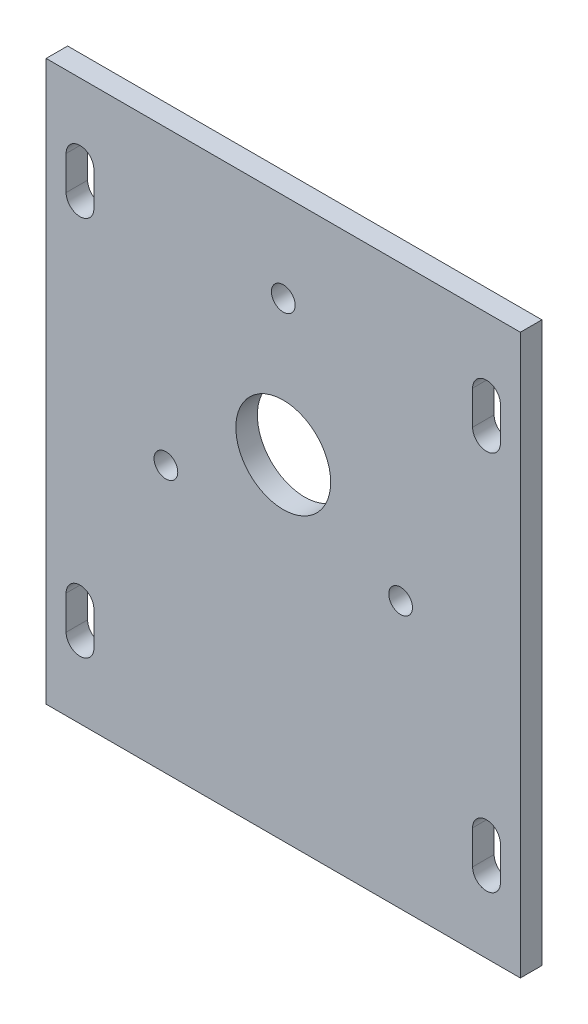
ISO-10303-21;
HEADER;
FILE_DESCRIPTION(('STEP AP214'),'2;1');
FILE_NAME('part.step','',(''),(''),'','','');
FILE_SCHEMA(('AUTOMOTIVE_DESIGN { 1 0 10303 214 1 1 1 1 }'));
ENDSEC;
DATA;
#1=APPLICATION_CONTEXT('core data for automotive mechanical design processes');
#2=APPLICATION_PROTOCOL_DEFINITION('international standard','automotive_design',2000,#1);
#3=PRODUCT_CONTEXT('',#1,'mechanical');
#4=PRODUCT('Part','Part','',(#3));
#5=PRODUCT_RELATED_PRODUCT_CATEGORY('part','',(#4));
#6=PRODUCT_DEFINITION_FORMATION('','',#4);
#7=PRODUCT_DEFINITION_CONTEXT('part definition',#1,'design');
#8=PRODUCT_DEFINITION('design','',#6,#7);
#9=PRODUCT_DEFINITION_SHAPE('','',#8);
#10=(LENGTH_UNIT() NAMED_UNIT(*) SI_UNIT(.MILLI.,.METRE.));
#11=(NAMED_UNIT(*) PLANE_ANGLE_UNIT() SI_UNIT($,.RADIAN.));
#12=(NAMED_UNIT(*) SI_UNIT($,.STERADIAN.) SOLID_ANGLE_UNIT());
#13=UNCERTAINTY_MEASURE_WITH_UNIT(LENGTH_MEASURE(1.E-05),#10,'distance_accuracy_value','');
#14=(GEOMETRIC_REPRESENTATION_CONTEXT(3) GLOBAL_UNCERTAINTY_ASSIGNED_CONTEXT((#13)) GLOBAL_UNIT_ASSIGNED_CONTEXT((#10,
#11,#12)) REPRESENTATION_CONTEXT('',''));
#15=CARTESIAN_POINT('',(0.,0.,0.));
#16=DIRECTION('',(0.,0.,1.));
#17=DIRECTION('',(1.,0.,0.));
#18=AXIS2_PLACEMENT_3D('',#15,#16,#17);
#19=CARTESIAN_POINT('',(0.,0.,3.175));
#20=DIRECTION('',(0.,0.,-1.));
#21=DIRECTION('',(-1.,0.,0.));
#22=AXIS2_PLACEMENT_3D('',#19,#20,#21);
#23=PLANE('',#22);
#24=CARTESIAN_POINT('',(-30.,-25.6,3.175));
#25=DIRECTION('',(0.,0.,1.));
#26=DIRECTION('',(-1.,0.,0.));
#27=AXIS2_PLACEMENT_3D('',#24,#25,#26);
#28=CIRCLE('',#27,2.05000000000001);
#29=CARTESIAN_POINT('',(-27.95,-25.6,3.175));
#30=VERTEX_POINT('',#29);
#31=CARTESIAN_POINT('',(-32.05,-25.6,3.175));
#32=VERTEX_POINT('',#31);
#33=EDGE_CURVE('E269',#30,#32,#28,.T.);
#34=ORIENTED_EDGE('',*,*,#33,.F.);
#35=DIRECTION('',(0.,1.,0.));
#36=VECTOR('',#35,1.);
#37=CARTESIAN_POINT('',(-27.95,-25.6,3.175));
#38=LINE('',#37,#36);
#39=CARTESIAN_POINT('',(-27.95,-30.6,3.175));
#40=VERTEX_POINT('',#39);
#41=EDGE_CURVE('E277',#40,#30,#38,.T.);
#42=ORIENTED_EDGE('',*,*,#41,.F.);
#43=CARTESIAN_POINT('',(-30.,-30.6,3.175));
#44=DIRECTION('',(0.,0.,1.));
#45=DIRECTION('',(-1.,0.,0.));
#46=AXIS2_PLACEMENT_3D('',#43,#44,#45);
#47=CIRCLE('',#46,2.05000000000001);
#48=CARTESIAN_POINT('',(-32.05,-30.6,3.175));
#49=VERTEX_POINT('',#48);
#50=EDGE_CURVE('E274',#49,#40,#47,.T.);
#51=ORIENTED_EDGE('',*,*,#50,.F.);
#52=DIRECTION('',(0.,-1.,0.));
#53=VECTOR('',#52,1.);
#54=CARTESIAN_POINT('',(-32.05,-25.6,3.175));
#55=LINE('',#54,#53);
#56=EDGE_CURVE('E271',#32,#49,#55,.T.);
#57=ORIENTED_EDGE('',*,*,#56,.F.);
#58=EDGE_LOOP('',(#34,#42,#51,#57));
#59=FACE_BOUND('',#58,.T.);
#60=CARTESIAN_POINT('',(-30.,25.6,3.175));
#61=DIRECTION('',(0.,0.,1.));
#62=DIRECTION('',(1.,0.,0.));
#63=AXIS2_PLACEMENT_3D('',#60,#61,#62);
#64=CIRCLE('',#63,2.05000000000001);
#65=CARTESIAN_POINT('',(-32.05,25.6,3.175));
#66=VERTEX_POINT('',#65);
#67=CARTESIAN_POINT('',(-27.95,25.6,3.175));
#68=VERTEX_POINT('',#67);
#69=EDGE_CURVE('E331',#66,#68,#64,.T.);
#70=ORIENTED_EDGE('',*,*,#69,.F.);
#71=DIRECTION('',(0.,-1.,0.));
#72=VECTOR('',#71,1.);
#73=CARTESIAN_POINT('',(-32.05,25.6,3.175));
#74=LINE('',#73,#72);
#75=CARTESIAN_POINT('',(-32.05,30.6,3.175));
#76=VERTEX_POINT('',#75);
#77=EDGE_CURVE('E339',#76,#66,#74,.T.);
#78=ORIENTED_EDGE('',*,*,#77,.F.);
#79=CARTESIAN_POINT('',(-30.,30.6,3.175));
#80=DIRECTION('',(0.,0.,1.));
#81=DIRECTION('',(1.,0.,0.));
#82=AXIS2_PLACEMENT_3D('',#79,#80,#81);
#83=CIRCLE('',#82,2.05000000000001);
#84=CARTESIAN_POINT('',(-27.95,30.6,3.175));
#85=VERTEX_POINT('',#84);
#86=EDGE_CURVE('E336',#85,#76,#83,.T.);
#87=ORIENTED_EDGE('',*,*,#86,.F.);
#88=DIRECTION('',(0.,1.,0.));
#89=VECTOR('',#88,1.);
#90=CARTESIAN_POINT('',(-27.95,25.6,3.175));
#91=LINE('',#90,#89);
#92=EDGE_CURVE('E333',#68,#85,#91,.T.);
#93=ORIENTED_EDGE('',*,*,#92,.F.);
#94=EDGE_LOOP('',(#70,#78,#87,#93));
#95=FACE_BOUND('',#94,.T.);
#96=DIRECTION('',(0.,1.,0.));
#97=VECTOR('',#96,1.);
#98=CARTESIAN_POINT('',(35.,-38.1,3.175));
#99=LINE('',#98,#97);
#100=CARTESIAN_POINT('',(35.,-41.275,3.175));
#101=VERTEX_POINT('',#100);
#102=CARTESIAN_POINT('',(35.,41.275,3.175));
#103=VERTEX_POINT('',#102);
#104=EDGE_CURVE('E52',#101,#103,#99,.T.);
#105=ORIENTED_EDGE('',*,*,#104,.T.);
#106=DIRECTION('',(-1.,0.,0.));
#107=VECTOR('',#106,1.);
#108=CARTESIAN_POINT('',(-35.,41.275,3.175));
#109=LINE('',#108,#107);
#110=CARTESIAN_POINT('',(-35.,41.275,3.175));
#111=VERTEX_POINT('',#110);
#112=EDGE_CURVE('E210',#103,#111,#109,.T.);
#113=ORIENTED_EDGE('',*,*,#112,.T.);
#114=DIRECTION('',(0.,-1.,0.));
#115=VECTOR('',#114,1.);
#116=CARTESIAN_POINT('',(-35.,-38.1,3.175));
#117=LINE('',#116,#115);
#118=CARTESIAN_POINT('',(-35.,-41.275,3.175));
#119=VERTEX_POINT('',#118);
#120=EDGE_CURVE('E11',#111,#119,#117,.T.);
#121=ORIENTED_EDGE('',*,*,#120,.T.);
#122=DIRECTION('',(1.,0.,0.));
#123=VECTOR('',#122,1.);
#124=CARTESIAN_POINT('',(-35.,-41.275,3.175));
#125=LINE('',#124,#123);
#126=EDGE_CURVE('E201',#119,#101,#125,.T.);
#127=ORIENTED_EDGE('',*,*,#126,.T.);
#128=EDGE_LOOP('',(#105,#113,#121,#127));
#129=FACE_BOUND('',#128,.T.);
#130=CARTESIAN_POINT('',(30.,25.6,3.175));
#131=DIRECTION('',(0.,0.,1.));
#132=DIRECTION('',(-1.,0.,0.));
#133=AXIS2_PLACEMENT_3D('',#130,#131,#132);
#134=CIRCLE('',#133,2.05000000000001);
#135=CARTESIAN_POINT('',(27.95,25.6,3.175));
#136=VERTEX_POINT('',#135);
#137=CARTESIAN_POINT('',(32.05,25.6,3.175));
#138=VERTEX_POINT('',#137);
#139=EDGE_CURVE('E300',#136,#138,#134,.T.);
#140=ORIENTED_EDGE('',*,*,#139,.F.);
#141=DIRECTION('',(0.,-1.,0.));
#142=VECTOR('',#141,1.);
#143=CARTESIAN_POINT('',(27.95,25.6,3.175));
#144=LINE('',#143,#142);
#145=CARTESIAN_POINT('',(27.95,30.6,3.175));
#146=VERTEX_POINT('',#145);
#147=EDGE_CURVE('E308',#146,#136,#144,.T.);
#148=ORIENTED_EDGE('',*,*,#147,.F.);
#149=CARTESIAN_POINT('',(30.,30.6,3.175));
#150=DIRECTION('',(0.,0.,1.));
#151=DIRECTION('',(-1.,0.,0.));
#152=AXIS2_PLACEMENT_3D('',#149,#150,#151);
#153=CIRCLE('',#152,2.05000000000001);
#154=CARTESIAN_POINT('',(32.05,30.6,3.175));
#155=VERTEX_POINT('',#154);
#156=EDGE_CURVE('E305',#155,#146,#153,.T.);
#157=ORIENTED_EDGE('',*,*,#156,.F.);
#158=DIRECTION('',(0.,1.,0.));
#159=VECTOR('',#158,1.);
#160=CARTESIAN_POINT('',(32.05,25.6,3.175));
#161=LINE('',#160,#159);
#162=EDGE_CURVE('E302',#138,#155,#161,.T.);
#163=ORIENTED_EDGE('',*,*,#162,.F.);
#164=EDGE_LOOP('',(#140,#148,#157,#163));
#165=FACE_BOUND('',#164,.T.);
#166=CARTESIAN_POINT('',(30.,-25.6,3.175));
#167=DIRECTION('',(0.,0.,1.));
#168=DIRECTION('',(1.,0.,0.));
#169=AXIS2_PLACEMENT_3D('',#166,#167,#168);
#170=CIRCLE('',#169,2.05000000000001);
#171=CARTESIAN_POINT('',(32.05,-25.6,3.175));
#172=VERTEX_POINT('',#171);
#173=CARTESIAN_POINT('',(27.95,-25.6,3.175));
#174=VERTEX_POINT('',#173);
#175=EDGE_CURVE('E243',#172,#174,#170,.T.);
#176=ORIENTED_EDGE('',*,*,#175,.F.);
#177=DIRECTION('',(0.,1.,0.));
#178=VECTOR('',#177,1.);
#179=CARTESIAN_POINT('',(32.05,-25.6,3.175));
#180=LINE('',#179,#178);
#181=CARTESIAN_POINT('',(32.05,-30.6,3.175));
#182=VERTEX_POINT('',#181);
#183=EDGE_CURVE('E250',#182,#172,#180,.T.);
#184=ORIENTED_EDGE('',*,*,#183,.F.);
#185=CARTESIAN_POINT('',(30.,-30.6,3.175));
#186=DIRECTION('',(0.,0.,1.));
#187=DIRECTION('',(1.,0.,0.));
#188=AXIS2_PLACEMENT_3D('',#185,#186,#187);
#189=CIRCLE('',#188,2.05000000000001);
#190=CARTESIAN_POINT('',(27.95,-30.6,3.175));
#191=VERTEX_POINT('',#190);
#192=EDGE_CURVE('E248',#191,#182,#189,.T.);
#193=ORIENTED_EDGE('',*,*,#192,.F.);
#194=DIRECTION('',(0.,-1.,0.));
#195=VECTOR('',#194,1.);
#196=CARTESIAN_POINT('',(27.95,-25.6,3.175));
#197=LINE('',#196,#195);
#198=EDGE_CURVE('E245',#174,#191,#197,.T.);
#199=ORIENTED_EDGE('',*,*,#198,.F.);
#200=EDGE_LOOP('',(#176,#184,#193,#199));
#201=FACE_BOUND('',#200,.T.);
#202=CARTESIAN_POINT('',(0.,28.1,3.175));
#203=DIRECTION('',(0.,0.,1.));
#204=DIRECTION('',(1.,0.,0.));
#205=AXIS2_PLACEMENT_3D('',#202,#203,#204);
#206=CIRCLE('',#205,1.75);
#207=CARTESIAN_POINT('',(1.75,28.1,3.175));
#208=VERTEX_POINT('',#207);
#209=EDGE_CURVE('E238',#208,#208,#206,.T.);
#210=ORIENTED_EDGE('',*,*,#209,.F.);
#211=EDGE_LOOP('',(#210));
#212=FACE_BOUND('',#211,.T.);
#213=CARTESIAN_POINT('',(0.,8.09999999999998,3.175));
#214=DIRECTION('',(0.,0.,1.));
#215=DIRECTION('',(1.,0.,0.));
#216=AXIS2_PLACEMENT_3D('',#213,#214,#215);
#217=CIRCLE('',#216,7.);
#218=CARTESIAN_POINT('',(7.,8.09999999999998,3.175));
#219=VERTEX_POINT('',#218);
#220=EDGE_CURVE('E232',#219,#219,#217,.T.);
#221=ORIENTED_EDGE('',*,*,#220,.F.);
#222=EDGE_LOOP('',(#221));
#223=FACE_BOUND('',#222,.T.);
#224=CARTESIAN_POINT('',(17.3205080756888,-1.90000000000003,3.175));
#225=DIRECTION('',(0.,0.,1.));
#226=DIRECTION('',(1.,0.,0.));
#227=AXIS2_PLACEMENT_3D('',#224,#225,#226);
#228=CIRCLE('',#227,1.74999999999871);
#229=CARTESIAN_POINT('',(19.0705080756875,-1.90000000000003,3.175));
#230=VERTEX_POINT('',#229);
#231=EDGE_CURVE('E226',#230,#230,#228,.T.);
#232=ORIENTED_EDGE('',*,*,#231,.F.);
#233=EDGE_LOOP('',(#232));
#234=FACE_BOUND('',#233,.T.);
#235=CARTESIAN_POINT('',(-17.3205080756888,-1.90000000000004,3.175));
#236=DIRECTION('',(0.,0.,1.));
#237=DIRECTION('',(1.,0.,0.));
#238=AXIS2_PLACEMENT_3D('',#235,#236,#237);
#239=CIRCLE('',#238,1.74999999999829);
#240=CARTESIAN_POINT('',(-15.5705080756905,-1.90000000000004,3.175));
#241=VERTEX_POINT('',#240);
#242=EDGE_CURVE('E220',#241,#241,#239,.T.);
#243=ORIENTED_EDGE('',*,*,#242,.F.);
#244=EDGE_LOOP('',(#243));
#245=FACE_BOUND('',#244,.T.);
#246=ADVANCED_FACE('F43',(#59,#95,#129,#165,#201,#212,#223,#234,#245),#23,.F.);
#247=CARTESIAN_POINT('',(0.,0.,0.));
#248=DIRECTION('',(0.,0.,-1.));
#249=DIRECTION('',(-1.,0.,0.));
#250=AXIS2_PLACEMENT_3D('',#247,#248,#249);
#251=PLANE('',#250);
#252=CARTESIAN_POINT('',(17.3205080756888,-1.90000000000003,0.));
#253=DIRECTION('',(0.,0.,1.));
#254=DIRECTION('',(1.,0.,0.));
#255=AXIS2_PLACEMENT_3D('',#252,#253,#254);
#256=CIRCLE('',#255,1.74999999999871);
#257=CARTESIAN_POINT('',(19.0705080756875,-1.90000000000003,0.));
#258=VERTEX_POINT('',#257);
#259=EDGE_CURVE('E223',#258,#258,#256,.T.);
#260=ORIENTED_EDGE('',*,*,#259,.T.);
#261=EDGE_LOOP('',(#260));
#262=FACE_BOUND('',#261,.T.);
#263=CARTESIAN_POINT('',(0.,28.1,0.));
#264=DIRECTION('',(0.,0.,1.));
#265=DIRECTION('',(1.,0.,0.));
#266=AXIS2_PLACEMENT_3D('',#263,#264,#265);
#267=CIRCLE('',#266,1.75);
#268=CARTESIAN_POINT('',(1.75,28.1,0.));
#269=VERTEX_POINT('',#268);
#270=EDGE_CURVE('E235',#269,#269,#267,.T.);
#271=ORIENTED_EDGE('',*,*,#270,.T.);
#272=EDGE_LOOP('',(#271));
#273=FACE_BOUND('',#272,.T.);
#274=DIRECTION('',(0.,1.,0.));
#275=VECTOR('',#274,1.);
#276=CARTESIAN_POINT('',(35.,-38.1,0.));
#277=LINE('',#276,#275);
#278=CARTESIAN_POINT('',(35.,-41.275,0.));
#279=VERTEX_POINT('',#278);
#280=CARTESIAN_POINT('',(35.,41.275,0.));
#281=VERTEX_POINT('',#280);
#282=EDGE_CURVE('E193',#279,#281,#277,.T.);
#283=ORIENTED_EDGE('',*,*,#282,.F.);
#284=DIRECTION('',(1.,0.,0.));
#285=VECTOR('',#284,1.);
#286=CARTESIAN_POINT('',(-35.,-41.275,0.));
#287=LINE('',#286,#285);
#288=CARTESIAN_POINT('',(-35.,-41.275,0.));
#289=VERTEX_POINT('',#288);
#290=EDGE_CURVE('E195',#289,#279,#287,.T.);
#291=ORIENTED_EDGE('',*,*,#290,.F.);
#292=DIRECTION('',(0.,-1.,0.));
#293=VECTOR('',#292,1.);
#294=CARTESIAN_POINT('',(-35.,-38.1,0.));
#295=LINE('',#294,#293);
#296=CARTESIAN_POINT('',(-35.,41.275,0.));
#297=VERTEX_POINT('',#296);
#298=EDGE_CURVE('E47',#297,#289,#295,.T.);
#299=ORIENTED_EDGE('',*,*,#298,.F.);
#300=DIRECTION('',(-1.,0.,0.));
#301=VECTOR('',#300,1.);
#302=CARTESIAN_POINT('',(-35.,41.275,0.));
#303=LINE('',#302,#301);
#304=EDGE_CURVE('E214',#281,#297,#303,.T.);
#305=ORIENTED_EDGE('',*,*,#304,.F.);
#306=EDGE_LOOP('',(#283,#291,#299,#305));
#307=FACE_BOUND('',#306,.T.);
#308=DIRECTION('',(0.,-1.,0.));
#309=VECTOR('',#308,1.);
#310=CARTESIAN_POINT('',(-32.05,25.6,0.));
#311=LINE('',#310,#309);
#312=CARTESIAN_POINT('',(-32.05,30.6,0.));
#313=VERTEX_POINT('',#312);
#314=CARTESIAN_POINT('',(-32.05,25.6,0.));
#315=VERTEX_POINT('',#314);
#316=EDGE_CURVE('E334',#313,#315,#311,.T.);
#317=ORIENTED_EDGE('',*,*,#316,.T.);
#318=CARTESIAN_POINT('',(-30.,25.6,0.));
#319=DIRECTION('',(0.,0.,1.));
#320=DIRECTION('',(1.,0.,0.));
#321=AXIS2_PLACEMENT_3D('',#318,#319,#320);
#322=CIRCLE('',#321,2.05000000000001);
#323=CARTESIAN_POINT('',(-27.95,25.6,0.));
#324=VERTEX_POINT('',#323);
#325=EDGE_CURVE('E330',#315,#324,#322,.T.);
#326=ORIENTED_EDGE('',*,*,#325,.T.);
#327=DIRECTION('',(0.,1.,0.));
#328=VECTOR('',#327,1.);
#329=CARTESIAN_POINT('',(-27.95,25.6,0.));
#330=LINE('',#329,#328);
#331=CARTESIAN_POINT('',(-27.95,30.6,0.));
#332=VERTEX_POINT('',#331);
#333=EDGE_CURVE('E344',#324,#332,#330,.T.);
#334=ORIENTED_EDGE('',*,*,#333,.T.);
#335=CARTESIAN_POINT('',(-30.,30.6,0.));
#336=DIRECTION('',(0.,0.,1.));
#337=DIRECTION('',(1.,0.,0.));
#338=AXIS2_PLACEMENT_3D('',#335,#336,#337);
#339=CIRCLE('',#338,2.05000000000001);
#340=EDGE_CURVE('E347',#332,#313,#339,.T.);
#341=ORIENTED_EDGE('',*,*,#340,.T.);
#342=EDGE_LOOP('',(#317,#326,#334,#341));
#343=FACE_BOUND('',#342,.T.);
#344=DIRECTION('',(0.,-1.,0.));
#345=VECTOR('',#344,1.);
#346=CARTESIAN_POINT('',(27.95,25.6,0.));
#347=LINE('',#346,#345);
#348=CARTESIAN_POINT('',(27.95,30.6,0.));
#349=VERTEX_POINT('',#348);
#350=CARTESIAN_POINT('',(27.95,25.6,0.));
#351=VERTEX_POINT('',#350);
#352=EDGE_CURVE('E303',#349,#351,#347,.T.);
#353=ORIENTED_EDGE('',*,*,#352,.T.);
#354=CARTESIAN_POINT('',(30.,25.6,0.));
#355=DIRECTION('',(0.,0.,1.));
#356=DIRECTION('',(-1.,0.,0.));
#357=AXIS2_PLACEMENT_3D('',#354,#355,#356);
#358=CIRCLE('',#357,2.05000000000001);
#359=CARTESIAN_POINT('',(32.05,25.6,0.));
#360=VERTEX_POINT('',#359);
#361=EDGE_CURVE('E299',#351,#360,#358,.T.);
#362=ORIENTED_EDGE('',*,*,#361,.T.);
#363=DIRECTION('',(0.,1.,0.));
#364=VECTOR('',#363,1.);
#365=CARTESIAN_POINT('',(32.05,25.6,0.));
#366=LINE('',#365,#364);
#367=CARTESIAN_POINT('',(32.05,30.6,0.));
#368=VERTEX_POINT('',#367);
#369=EDGE_CURVE('E313',#360,#368,#366,.T.);
#370=ORIENTED_EDGE('',*,*,#369,.T.);
#371=CARTESIAN_POINT('',(30.,30.6,0.));
#372=DIRECTION('',(0.,0.,1.));
#373=DIRECTION('',(-1.,0.,0.));
#374=AXIS2_PLACEMENT_3D('',#371,#372,#373);
#375=CIRCLE('',#374,2.05000000000001);
#376=EDGE_CURVE('E316',#368,#349,#375,.T.);
#377=ORIENTED_EDGE('',*,*,#376,.T.);
#378=EDGE_LOOP('',(#353,#362,#370,#377));
#379=FACE_BOUND('',#378,.T.);
#380=DIRECTION('',(0.,1.,0.));
#381=VECTOR('',#380,1.);
#382=CARTESIAN_POINT('',(-27.95,-25.6,0.));
#383=LINE('',#382,#381);
#384=CARTESIAN_POINT('',(-27.95,-30.6,0.));
#385=VERTEX_POINT('',#384);
#386=CARTESIAN_POINT('',(-27.95,-25.6,0.));
#387=VERTEX_POINT('',#386);
#388=EDGE_CURVE('E272',#385,#387,#383,.T.);
#389=ORIENTED_EDGE('',*,*,#388,.T.);
#390=CARTESIAN_POINT('',(-30.,-25.6,0.));
#391=DIRECTION('',(0.,0.,1.));
#392=DIRECTION('',(-1.,0.,0.));
#393=AXIS2_PLACEMENT_3D('',#390,#391,#392);
#394=CIRCLE('',#393,2.05000000000001);
#395=CARTESIAN_POINT('',(-32.05,-25.6,0.));
#396=VERTEX_POINT('',#395);
#397=EDGE_CURVE('E268',#387,#396,#394,.T.);
#398=ORIENTED_EDGE('',*,*,#397,.T.);
#399=DIRECTION('',(0.,-1.,0.));
#400=VECTOR('',#399,1.);
#401=CARTESIAN_POINT('',(-32.05,-25.6,0.));
#402=LINE('',#401,#400);
#403=CARTESIAN_POINT('',(-32.05,-30.6,0.));
#404=VERTEX_POINT('',#403);
#405=EDGE_CURVE('E282',#396,#404,#402,.T.);
#406=ORIENTED_EDGE('',*,*,#405,.T.);
#407=CARTESIAN_POINT('',(-30.,-30.6,0.));
#408=DIRECTION('',(0.,0.,1.));
#409=DIRECTION('',(-1.,0.,0.));
#410=AXIS2_PLACEMENT_3D('',#407,#408,#409);
#411=CIRCLE('',#410,2.05000000000001);
#412=EDGE_CURVE('E285',#404,#385,#411,.T.);
#413=ORIENTED_EDGE('',*,*,#412,.T.);
#414=EDGE_LOOP('',(#389,#398,#406,#413));
#415=FACE_BOUND('',#414,.T.);
#416=DIRECTION('',(0.,1.,0.));
#417=VECTOR('',#416,1.);
#418=CARTESIAN_POINT('',(32.05,-25.6,0.));
#419=LINE('',#418,#417);
#420=CARTESIAN_POINT('',(32.05,-30.6,0.));
#421=VERTEX_POINT('',#420);
#422=CARTESIAN_POINT('',(32.05,-25.6,0.));
#423=VERTEX_POINT('',#422);
#424=EDGE_CURVE('E246',#421,#423,#419,.T.);
#425=ORIENTED_EDGE('',*,*,#424,.T.);
#426=CARTESIAN_POINT('',(30.,-25.6,0.));
#427=DIRECTION('',(0.,0.,1.));
#428=DIRECTION('',(1.,0.,0.));
#429=AXIS2_PLACEMENT_3D('',#426,#427,#428);
#430=CIRCLE('',#429,2.05000000000001);
#431=CARTESIAN_POINT('',(27.95,-25.6,0.));
#432=VERTEX_POINT('',#431);
#433=EDGE_CURVE('E68',#423,#432,#430,.T.);
#434=ORIENTED_EDGE('',*,*,#433,.T.);
#435=DIRECTION('',(0.,-1.,0.));
#436=VECTOR('',#435,1.);
#437=CARTESIAN_POINT('',(27.95,-25.6,0.));
#438=LINE('',#437,#436);
#439=CARTESIAN_POINT('',(27.95,-30.6,0.));
#440=VERTEX_POINT('',#439);
#441=EDGE_CURVE('E254',#432,#440,#438,.T.);
#442=ORIENTED_EDGE('',*,*,#441,.T.);
#443=CARTESIAN_POINT('',(30.,-30.6,0.));
#444=DIRECTION('',(0.,0.,1.));
#445=DIRECTION('',(1.,0.,0.));
#446=AXIS2_PLACEMENT_3D('',#443,#444,#445);
#447=CIRCLE('',#446,2.05000000000001);
#448=EDGE_CURVE('E257',#440,#421,#447,.T.);
#449=ORIENTED_EDGE('',*,*,#448,.T.);
#450=EDGE_LOOP('',(#425,#434,#442,#449));
#451=FACE_BOUND('',#450,.T.);
#452=CARTESIAN_POINT('',(0.,8.09999999999998,0.));
#453=DIRECTION('',(0.,0.,1.));
#454=DIRECTION('',(1.,0.,0.));
#455=AXIS2_PLACEMENT_3D('',#452,#453,#454);
#456=CIRCLE('',#455,7.);
#457=CARTESIAN_POINT('',(7.,8.09999999999998,0.));
#458=VERTEX_POINT('',#457);
#459=EDGE_CURVE('E229',#458,#458,#456,.T.);
#460=ORIENTED_EDGE('',*,*,#459,.T.);
#461=EDGE_LOOP('',(#460));
#462=FACE_BOUND('',#461,.T.);
#463=CARTESIAN_POINT('',(-17.3205080756888,-1.90000000000004,0.));
#464=DIRECTION('',(0.,0.,1.));
#465=DIRECTION('',(1.,0.,0.));
#466=AXIS2_PLACEMENT_3D('',#463,#464,#465);
#467=CIRCLE('',#466,1.74999999999829);
#468=CARTESIAN_POINT('',(-15.5705080756905,-1.90000000000004,0.));
#469=VERTEX_POINT('',#468);
#470=EDGE_CURVE('E217',#469,#469,#467,.T.);
#471=ORIENTED_EDGE('',*,*,#470,.T.);
#472=EDGE_LOOP('',(#471));
#473=FACE_BOUND('',#472,.T.);
#474=ADVANCED_FACE('F196',(#262,#273,#307,#343,#379,#415,#451,#462,#473),#251,.T.);
#475=CARTESIAN_POINT('',(35.,-38.1,3.175));
#476=DIRECTION('',(-1.,0.,0.));
#477=DIRECTION('',(0.,0.,1.));
#478=AXIS2_PLACEMENT_3D('',#475,#476,#477);
#479=PLANE('',#478);
#480=ORIENTED_EDGE('',*,*,#282,.T.);
#481=DIRECTION('',(0.,0.,1.));
#482=VECTOR('',#481,1.);
#483=CARTESIAN_POINT('',(35.,41.275,-70.071967469167));
#484=LINE('',#483,#482);
#485=EDGE_CURVE('E213',#281,#103,#484,.T.);
#486=ORIENTED_EDGE('',*,*,#485,.T.);
#487=ORIENTED_EDGE('',*,*,#104,.F.);
#488=DIRECTION('',(0.,0.,1.));
#489=VECTOR('',#488,1.);
#490=CARTESIAN_POINT('',(35.,-41.275,-70.071967469167));
#491=LINE('',#490,#489);
#492=EDGE_CURVE('E202',#279,#101,#491,.T.);
#493=ORIENTED_EDGE('',*,*,#492,.F.);
#494=EDGE_LOOP('',(#480,#486,#487,#493));
#495=FACE_BOUND('',#494,.T.);
#496=ADVANCED_FACE('F45',(#495),#479,.F.);
#497=CARTESIAN_POINT('',(-35.,-38.1,3.175));
#498=DIRECTION('',(1.,0.,0.));
#499=DIRECTION('',(0.,0.,-1.));
#500=AXIS2_PLACEMENT_3D('',#497,#498,#499);
#501=PLANE('',#500);
#502=ORIENTED_EDGE('',*,*,#298,.T.);
#503=DIRECTION('',(0.,0.,1.));
#504=VECTOR('',#503,1.);
#505=CARTESIAN_POINT('',(-35.,-41.275,-70.071967469167));
#506=LINE('',#505,#504);
#507=EDGE_CURVE('E186',#289,#119,#506,.T.);
#508=ORIENTED_EDGE('',*,*,#507,.T.);
#509=ORIENTED_EDGE('',*,*,#120,.F.);
#510=DIRECTION('',(0.,0.,1.));
#511=VECTOR('',#510,1.);
#512=CARTESIAN_POINT('',(-35.,41.275,-70.071967469167));
#513=LINE('',#512,#511);
#514=EDGE_CURVE('E189',#297,#111,#513,.T.);
#515=ORIENTED_EDGE('',*,*,#514,.F.);
#516=EDGE_LOOP('',(#502,#508,#509,#515));
#517=FACE_BOUND('',#516,.T.);
#518=ADVANCED_FACE('F184',(#517),#501,.F.);
#519=CARTESIAN_POINT('',(-30.,25.6,3.175));
#520=DIRECTION('',(0.,0.,-1.));
#521=DIRECTION('',(-1.,0.,0.));
#522=AXIS2_PLACEMENT_3D('',#519,#520,#521);
#523=CYLINDRICAL_SURFACE('',#522,2.05000000000001);
#524=ORIENTED_EDGE('',*,*,#325,.F.);
#525=DIRECTION('',(0.,0.,-1.));
#526=VECTOR('',#525,1.);
#527=CARTESIAN_POINT('',(-32.05,25.6,3.175));
#528=LINE('',#527,#526);
#529=EDGE_CURVE('E341',#66,#315,#528,.T.);
#530=ORIENTED_EDGE('',*,*,#529,.F.);
#531=ORIENTED_EDGE('',*,*,#69,.T.);
#532=DIRECTION('',(0.,0.,-1.));
#533=VECTOR('',#532,1.);
#534=CARTESIAN_POINT('',(-27.95,25.6,3.175));
#535=LINE('',#534,#533);
#536=EDGE_CURVE('E358',#68,#324,#535,.T.);
#537=ORIENTED_EDGE('',*,*,#536,.T.);
#538=EDGE_LOOP('',(#524,#530,#531,#537));
#539=FACE_BOUND('',#538,.T.);
#540=ADVANCED_FACE('F403',(#539),#523,.F.);
#541=CARTESIAN_POINT('',(-27.95,25.6,3.175));
#542=DIRECTION('',(-1.,0.,0.));
#543=DIRECTION('',(0.,0.,1.));
#544=AXIS2_PLACEMENT_3D('',#541,#542,#543);
#545=PLANE('',#544);
#546=ORIENTED_EDGE('',*,*,#333,.F.);
#547=ORIENTED_EDGE('',*,*,#536,.F.);
#548=ORIENTED_EDGE('',*,*,#92,.T.);
#549=DIRECTION('',(0.,0.,-1.));
#550=VECTOR('',#549,1.);
#551=CARTESIAN_POINT('',(-27.95,30.6,3.175));
#552=LINE('',#551,#550);
#553=EDGE_CURVE('E356',#85,#332,#552,.T.);
#554=ORIENTED_EDGE('',*,*,#553,.T.);
#555=EDGE_LOOP('',(#546,#547,#548,#554));
#556=FACE_BOUND('',#555,.T.);
#557=ADVANCED_FACE('F408',(#556),#545,.T.);
#558=CARTESIAN_POINT('',(-30.,30.6,3.175));
#559=DIRECTION('',(0.,0.,-1.));
#560=DIRECTION('',(-1.,0.,0.));
#561=AXIS2_PLACEMENT_3D('',#558,#559,#560);
#562=CYLINDRICAL_SURFACE('',#561,2.05000000000001);
#563=ORIENTED_EDGE('',*,*,#340,.F.);
#564=ORIENTED_EDGE('',*,*,#553,.F.);
#565=ORIENTED_EDGE('',*,*,#86,.T.);
#566=DIRECTION('',(0.,0.,-1.));
#567=VECTOR('',#566,1.);
#568=CARTESIAN_POINT('',(-32.05,30.6,3.175));
#569=LINE('',#568,#567);
#570=EDGE_CURVE('E354',#76,#313,#569,.T.);
#571=ORIENTED_EDGE('',*,*,#570,.T.);
#572=EDGE_LOOP('',(#563,#564,#565,#571));
#573=FACE_BOUND('',#572,.T.);
#574=ADVANCED_FACE('F413',(#573),#562,.F.);
#575=CARTESIAN_POINT('',(-32.05,25.6,3.175));
#576=DIRECTION('',(1.,0.,0.));
#577=DIRECTION('',(0.,0.,-1.));
#578=AXIS2_PLACEMENT_3D('',#575,#576,#577);
#579=PLANE('',#578);
#580=ORIENTED_EDGE('',*,*,#316,.F.);
#581=ORIENTED_EDGE('',*,*,#570,.F.);
#582=ORIENTED_EDGE('',*,*,#77,.T.);
#583=ORIENTED_EDGE('',*,*,#529,.T.);
#584=EDGE_LOOP('',(#580,#581,#582,#583));
#585=FACE_BOUND('',#584,.T.);
#586=ADVANCED_FACE('F419',(#585),#579,.T.);
#587=CARTESIAN_POINT('',(30.,25.6,3.175));
#588=DIRECTION('',(0.,0.,-1.));
#589=DIRECTION('',(-1.,0.,0.));
#590=AXIS2_PLACEMENT_3D('',#587,#588,#589);
#591=CYLINDRICAL_SURFACE('',#590,2.05000000000001);
#592=ORIENTED_EDGE('',*,*,#361,.F.);
#593=DIRECTION('',(0.,0.,-1.));
#594=VECTOR('',#593,1.);
#595=CARTESIAN_POINT('',(27.95,25.6,3.175));
#596=LINE('',#595,#594);
#597=EDGE_CURVE('E310',#136,#351,#596,.T.);
#598=ORIENTED_EDGE('',*,*,#597,.F.);
#599=ORIENTED_EDGE('',*,*,#139,.T.);
#600=DIRECTION('',(0.,0.,-1.));
#601=VECTOR('',#600,1.);
#602=CARTESIAN_POINT('',(32.05,25.6,3.175));
#603=LINE('',#602,#601);
#604=EDGE_CURVE('E327',#138,#360,#603,.T.);
#605=ORIENTED_EDGE('',*,*,#604,.T.);
#606=EDGE_LOOP('',(#592,#598,#599,#605));
#607=FACE_BOUND('',#606,.T.);
#608=ADVANCED_FACE('F423',(#607),#591,.F.);
#609=CARTESIAN_POINT('',(32.05,25.6,3.175));
#610=DIRECTION('',(-1.,0.,0.));
#611=DIRECTION('',(0.,0.,1.));
#612=AXIS2_PLACEMENT_3D('',#609,#610,#611);
#613=PLANE('',#612);
#614=ORIENTED_EDGE('',*,*,#369,.F.);
#615=ORIENTED_EDGE('',*,*,#604,.F.);
#616=ORIENTED_EDGE('',*,*,#162,.T.);
#617=DIRECTION('',(0.,0.,-1.));
#618=VECTOR('',#617,1.);
#619=CARTESIAN_POINT('',(32.05,30.6,3.175));
#620=LINE('',#619,#618);
#621=EDGE_CURVE('E325',#155,#368,#620,.T.);
#622=ORIENTED_EDGE('',*,*,#621,.T.);
#623=EDGE_LOOP('',(#614,#615,#616,#622));
#624=FACE_BOUND('',#623,.T.);
#625=ADVANCED_FACE('F427',(#624),#613,.T.);
#626=CARTESIAN_POINT('',(30.,30.6,3.175));
#627=DIRECTION('',(0.,0.,-1.));
#628=DIRECTION('',(-1.,0.,0.));
#629=AXIS2_PLACEMENT_3D('',#626,#627,#628);
#630=CYLINDRICAL_SURFACE('',#629,2.05000000000001);
#631=ORIENTED_EDGE('',*,*,#376,.F.);
#632=ORIENTED_EDGE('',*,*,#621,.F.);
#633=ORIENTED_EDGE('',*,*,#156,.T.);
#634=DIRECTION('',(0.,0.,-1.));
#635=VECTOR('',#634,1.);
#636=CARTESIAN_POINT('',(27.95,30.6,3.175));
#637=LINE('',#636,#635);
#638=EDGE_CURVE('E323',#146,#349,#637,.T.);
#639=ORIENTED_EDGE('',*,*,#638,.T.);
#640=EDGE_LOOP('',(#631,#632,#633,#639));
#641=FACE_BOUND('',#640,.T.);
#642=ADVANCED_FACE('F431',(#641),#630,.F.);
#643=CARTESIAN_POINT('',(27.95,25.6,3.175));
#644=DIRECTION('',(1.,0.,0.));
#645=DIRECTION('',(0.,0.,-1.));
#646=AXIS2_PLACEMENT_3D('',#643,#644,#645);
#647=PLANE('',#646);
#648=ORIENTED_EDGE('',*,*,#352,.F.);
#649=ORIENTED_EDGE('',*,*,#638,.F.);
#650=ORIENTED_EDGE('',*,*,#147,.T.);
#651=ORIENTED_EDGE('',*,*,#597,.T.);
#652=EDGE_LOOP('',(#648,#649,#650,#651));
#653=FACE_BOUND('',#652,.T.);
#654=ADVANCED_FACE('F435',(#653),#647,.T.);
#655=CARTESIAN_POINT('',(-30.,-25.6,3.175));
#656=DIRECTION('',(0.,0.,-1.));
#657=DIRECTION('',(-1.,0.,0.));
#658=AXIS2_PLACEMENT_3D('',#655,#656,#657);
#659=CYLINDRICAL_SURFACE('',#658,2.05000000000001);
#660=ORIENTED_EDGE('',*,*,#397,.F.);
#661=DIRECTION('',(0.,0.,-1.));
#662=VECTOR('',#661,1.);
#663=CARTESIAN_POINT('',(-27.95,-25.6,3.175));
#664=LINE('',#663,#662);
#665=EDGE_CURVE('E279',#30,#387,#664,.T.);
#666=ORIENTED_EDGE('',*,*,#665,.F.);
#667=ORIENTED_EDGE('',*,*,#33,.T.);
#668=DIRECTION('',(0.,0.,-1.));
#669=VECTOR('',#668,1.);
#670=CARTESIAN_POINT('',(-32.05,-25.6,3.175));
#671=LINE('',#670,#669);
#672=EDGE_CURVE('E296',#32,#396,#671,.T.);
#673=ORIENTED_EDGE('',*,*,#672,.T.);
#674=EDGE_LOOP('',(#660,#666,#667,#673));
#675=FACE_BOUND('',#674,.T.);
#676=ADVANCED_FACE('F439',(#675),#659,.F.);
#677=CARTESIAN_POINT('',(-32.05,-25.6,3.175));
#678=DIRECTION('',(1.,0.,0.));
#679=DIRECTION('',(0.,0.,-1.));
#680=AXIS2_PLACEMENT_3D('',#677,#678,#679);
#681=PLANE('',#680);
#682=ORIENTED_EDGE('',*,*,#405,.F.);
#683=ORIENTED_EDGE('',*,*,#672,.F.);
#684=ORIENTED_EDGE('',*,*,#56,.T.);
#685=DIRECTION('',(0.,0.,-1.));
#686=VECTOR('',#685,1.);
#687=CARTESIAN_POINT('',(-32.05,-30.6,3.175));
#688=LINE('',#687,#686);
#689=EDGE_CURVE('E294',#49,#404,#688,.T.);
#690=ORIENTED_EDGE('',*,*,#689,.T.);
#691=EDGE_LOOP('',(#682,#683,#684,#690));
#692=FACE_BOUND('',#691,.T.);
#693=ADVANCED_FACE('F443',(#692),#681,.T.);
#694=CARTESIAN_POINT('',(-30.,-30.6,3.175));
#695=DIRECTION('',(0.,0.,-1.));
#696=DIRECTION('',(-1.,0.,0.));
#697=AXIS2_PLACEMENT_3D('',#694,#695,#696);
#698=CYLINDRICAL_SURFACE('',#697,2.05000000000001);
#699=ORIENTED_EDGE('',*,*,#412,.F.);
#700=ORIENTED_EDGE('',*,*,#689,.F.);
#701=ORIENTED_EDGE('',*,*,#50,.T.);
#702=DIRECTION('',(0.,0.,-1.));
#703=VECTOR('',#702,1.);
#704=CARTESIAN_POINT('',(-27.95,-30.6,3.175));
#705=LINE('',#704,#703);
#706=EDGE_CURVE('E292',#40,#385,#705,.T.);
#707=ORIENTED_EDGE('',*,*,#706,.T.);
#708=EDGE_LOOP('',(#699,#700,#701,#707));
#709=FACE_BOUND('',#708,.T.);
#710=ADVANCED_FACE('F447',(#709),#698,.F.);
#711=CARTESIAN_POINT('',(-27.95,-25.6,3.175));
#712=DIRECTION('',(-1.,0.,0.));
#713=DIRECTION('',(0.,0.,1.));
#714=AXIS2_PLACEMENT_3D('',#711,#712,#713);
#715=PLANE('',#714);
#716=ORIENTED_EDGE('',*,*,#388,.F.);
#717=ORIENTED_EDGE('',*,*,#706,.F.);
#718=ORIENTED_EDGE('',*,*,#41,.T.);
#719=ORIENTED_EDGE('',*,*,#665,.T.);
#720=EDGE_LOOP('',(#716,#717,#718,#719));
#721=FACE_BOUND('',#720,.T.);
#722=ADVANCED_FACE('F451',(#721),#715,.T.);
#723=CARTESIAN_POINT('',(30.,-25.6,3.175));
#724=DIRECTION('',(0.,0.,-1.));
#725=DIRECTION('',(-1.,0.,0.));
#726=AXIS2_PLACEMENT_3D('',#723,#724,#725);
#727=CYLINDRICAL_SURFACE('',#726,2.05000000000001);
#728=ORIENTED_EDGE('',*,*,#433,.F.);
#729=DIRECTION('',(0.,0.,-1.));
#730=VECTOR('',#729,1.);
#731=CARTESIAN_POINT('',(32.05,-25.6,3.175));
#732=LINE('',#731,#730);
#733=EDGE_CURVE('E252',#172,#423,#732,.T.);
#734=ORIENTED_EDGE('',*,*,#733,.F.);
#735=ORIENTED_EDGE('',*,*,#175,.T.);
#736=DIRECTION('',(0.,0.,-1.));
#737=VECTOR('',#736,1.);
#738=CARTESIAN_POINT('',(27.95,-25.6,3.175));
#739=LINE('',#738,#737);
#740=EDGE_CURVE('E266',#174,#432,#739,.T.);
#741=ORIENTED_EDGE('',*,*,#740,.T.);
#742=EDGE_LOOP('',(#728,#734,#735,#741));
#743=FACE_BOUND('',#742,.T.);
#744=ADVANCED_FACE('F455',(#743),#727,.F.);
#745=CARTESIAN_POINT('',(27.95,-25.6,3.175));
#746=DIRECTION('',(1.,0.,0.));
#747=DIRECTION('',(0.,0.,-1.));
#748=AXIS2_PLACEMENT_3D('',#745,#746,#747);
#749=PLANE('',#748);
#750=ORIENTED_EDGE('',*,*,#441,.F.);
#751=ORIENTED_EDGE('',*,*,#740,.F.);
#752=ORIENTED_EDGE('',*,*,#198,.T.);
#753=DIRECTION('',(0.,0.,-1.));
#754=VECTOR('',#753,1.);
#755=CARTESIAN_POINT('',(27.95,-30.6,3.175));
#756=LINE('',#755,#754);
#757=EDGE_CURVE('E264',#191,#440,#756,.T.);
#758=ORIENTED_EDGE('',*,*,#757,.T.);
#759=EDGE_LOOP('',(#750,#751,#752,#758));
#760=FACE_BOUND('',#759,.T.);
#761=ADVANCED_FACE('F459',(#760),#749,.T.);
#762=CARTESIAN_POINT('',(30.,-30.6,3.175));
#763=DIRECTION('',(0.,0.,-1.));
#764=DIRECTION('',(-1.,0.,0.));
#765=AXIS2_PLACEMENT_3D('',#762,#763,#764);
#766=CYLINDRICAL_SURFACE('',#765,2.05000000000001);
#767=ORIENTED_EDGE('',*,*,#448,.F.);
#768=ORIENTED_EDGE('',*,*,#757,.F.);
#769=ORIENTED_EDGE('',*,*,#192,.T.);
#770=DIRECTION('',(0.,0.,-1.));
#771=VECTOR('',#770,1.);
#772=CARTESIAN_POINT('',(32.05,-30.6,3.175));
#773=LINE('',#772,#771);
#774=EDGE_CURVE('E60',#182,#421,#773,.T.);
#775=ORIENTED_EDGE('',*,*,#774,.T.);
#776=EDGE_LOOP('',(#767,#768,#769,#775));
#777=FACE_BOUND('',#776,.T.);
#778=ADVANCED_FACE('F462',(#777),#766,.F.);
#779=CARTESIAN_POINT('',(32.05,-25.6,3.175));
#780=DIRECTION('',(-1.,0.,0.));
#781=DIRECTION('',(0.,0.,1.));
#782=AXIS2_PLACEMENT_3D('',#779,#780,#781);
#783=PLANE('',#782);
#784=ORIENTED_EDGE('',*,*,#424,.F.);
#785=ORIENTED_EDGE('',*,*,#774,.F.);
#786=ORIENTED_EDGE('',*,*,#183,.T.);
#787=ORIENTED_EDGE('',*,*,#733,.T.);
#788=EDGE_LOOP('',(#784,#785,#786,#787));
#789=FACE_BOUND('',#788,.T.);
#790=ADVANCED_FACE('F466',(#789),#783,.T.);
#791=CARTESIAN_POINT('',(0.,28.1,3.175));
#792=DIRECTION('',(0.,0.,-1.));
#793=DIRECTION('',(-1.,0.,0.));
#794=AXIS2_PLACEMENT_3D('',#791,#792,#793);
#795=CYLINDRICAL_SURFACE('',#794,1.75);
#796=ORIENTED_EDGE('',*,*,#209,.T.);
#797=EDGE_LOOP('',(#796));
#798=FACE_BOUND('',#797,.T.);
#799=ORIENTED_EDGE('',*,*,#270,.F.);
#800=EDGE_LOOP('',(#799));
#801=FACE_BOUND('',#800,.T.);
#802=ADVANCED_FACE('F470',(#798,#801),#795,.F.);
#803=CARTESIAN_POINT('',(0.,8.09999999999998,3.175));
#804=DIRECTION('',(0.,0.,-1.));
#805=DIRECTION('',(-1.,0.,0.));
#806=AXIS2_PLACEMENT_3D('',#803,#804,#805);
#807=CYLINDRICAL_SURFACE('',#806,7.);
#808=ORIENTED_EDGE('',*,*,#220,.T.);
#809=EDGE_LOOP('',(#808));
#810=FACE_BOUND('',#809,.T.);
#811=ORIENTED_EDGE('',*,*,#459,.F.);
#812=EDGE_LOOP('',(#811));
#813=FACE_BOUND('',#812,.T.);
#814=ADVANCED_FACE('F473',(#810,#813),#807,.F.);
#815=CARTESIAN_POINT('',(17.3205080756888,-1.90000000000003,3.175));
#816=DIRECTION('',(0.,0.,-1.));
#817=DIRECTION('',(-1.,0.,0.));
#818=AXIS2_PLACEMENT_3D('',#815,#816,#817);
#819=CYLINDRICAL_SURFACE('',#818,1.74999999999871);
#820=ORIENTED_EDGE('',*,*,#231,.T.);
#821=EDGE_LOOP('',(#820));
#822=FACE_BOUND('',#821,.T.);
#823=ORIENTED_EDGE('',*,*,#259,.F.);
#824=EDGE_LOOP('',(#823));
#825=FACE_BOUND('',#824,.T.);
#826=ADVANCED_FACE('F390',(#822,#825),#819,.F.);
#827=CARTESIAN_POINT('',(-17.3205080756888,-1.90000000000004,3.175));
#828=DIRECTION('',(0.,0.,-1.));
#829=DIRECTION('',(-1.,0.,0.));
#830=AXIS2_PLACEMENT_3D('',#827,#828,#829);
#831=CYLINDRICAL_SURFACE('',#830,1.74999999999829);
#832=ORIENTED_EDGE('',*,*,#242,.T.);
#833=EDGE_LOOP('',(#832));
#834=FACE_BOUND('',#833,.T.);
#835=ORIENTED_EDGE('',*,*,#470,.F.);
#836=EDGE_LOOP('',(#835));
#837=FACE_BOUND('',#836,.T.);
#838=ADVANCED_FACE('F387',(#834,#837),#831,.F.);
#839=CARTESIAN_POINT('',(-35.,41.275,-70.071967469167));
#840=DIRECTION('',(0.,1.,0.));
#841=DIRECTION('',(0.,0.,1.));
#842=AXIS2_PLACEMENT_3D('',#839,#840,#841);
#843=PLANE('',#842);
#844=ORIENTED_EDGE('',*,*,#485,.F.);
#845=ORIENTED_EDGE('',*,*,#304,.T.);
#846=ORIENTED_EDGE('',*,*,#514,.T.);
#847=ORIENTED_EDGE('',*,*,#112,.F.);
#848=EDGE_LOOP('',(#844,#845,#846,#847));
#849=FACE_BOUND('',#848,.T.);
#850=ADVANCED_FACE('F365',(#849),#843,.T.);
#851=CARTESIAN_POINT('',(-35.,-41.275,-70.071967469167));
#852=DIRECTION('',(0.,-1.,0.));
#853=DIRECTION('',(0.,0.,-1.));
#854=AXIS2_PLACEMENT_3D('',#851,#852,#853);
#855=PLANE('',#854);
#856=ORIENTED_EDGE('',*,*,#507,.F.);
#857=ORIENTED_EDGE('',*,*,#290,.T.);
#858=ORIENTED_EDGE('',*,*,#492,.T.);
#859=ORIENTED_EDGE('',*,*,#126,.F.);
#860=EDGE_LOOP('',(#856,#857,#858,#859));
#861=FACE_BOUND('',#860,.T.);
#862=ADVANCED_FACE('F204',(#861),#855,.T.);
#863=CLOSED_SHELL('',(#246,#474,#496,#518,#540,#557,#574,#586,#608,#625,#642,#654,#676,#693,
#710,#722,#744,#761,#778,#790,#802,#814,#826,#838,#850,#862));
#864=MANIFOLD_SOLID_BREP('B2',#863);
#865=ADVANCED_BREP_SHAPE_REPRESENTATION('',(#18,#864),#14);
#866=SHAPE_DEFINITION_REPRESENTATION(#9,#865);
ENDSEC;
END-ISO-10303-21;
